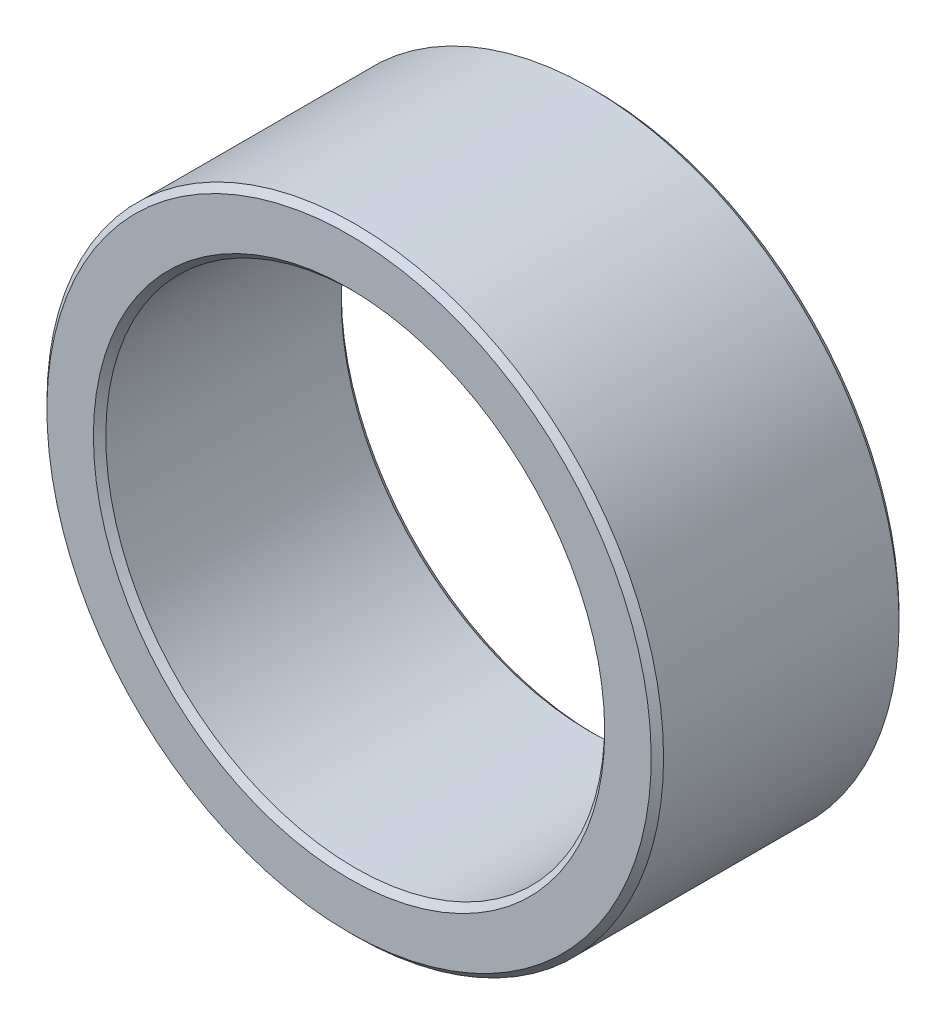
ISO-10303-21;
HEADER;
FILE_DESCRIPTION(('STEP AP214'),'2;1');
FILE_NAME('part.step','',(''),(''),'','','');
FILE_SCHEMA(('AUTOMOTIVE_DESIGN { 1 0 10303 214 1 1 1 1 }'));
ENDSEC;
DATA;
#1=APPLICATION_CONTEXT('core data for automotive mechanical design processes');
#2=APPLICATION_PROTOCOL_DEFINITION('international standard','automotive_design',2000,#1);
#3=PRODUCT_CONTEXT('',#1,'mechanical');
#4=PRODUCT('Part','Part','',(#3));
#5=PRODUCT_RELATED_PRODUCT_CATEGORY('part','',(#4));
#6=PRODUCT_DEFINITION_FORMATION('','',#4);
#7=PRODUCT_DEFINITION_CONTEXT('part definition',#1,'design');
#8=PRODUCT_DEFINITION('design','',#6,#7);
#9=PRODUCT_DEFINITION_SHAPE('','',#8);
#10=(LENGTH_UNIT() NAMED_UNIT(*) SI_UNIT(.MILLI.,.METRE.));
#11=(NAMED_UNIT(*) PLANE_ANGLE_UNIT() SI_UNIT($,.RADIAN.));
#12=(NAMED_UNIT(*) SI_UNIT($,.STERADIAN.) SOLID_ANGLE_UNIT());
#13=UNCERTAINTY_MEASURE_WITH_UNIT(LENGTH_MEASURE(1.E-05),#10,'distance_accuracy_value','');
#14=(GEOMETRIC_REPRESENTATION_CONTEXT(3) GLOBAL_UNCERTAINTY_ASSIGNED_CONTEXT((#13)) GLOBAL_UNIT_ASSIGNED_CONTEXT((#10,
#11,#12)) REPRESENTATION_CONTEXT('',''));
#15=CARTESIAN_POINT('',(0.,0.,0.));
#16=DIRECTION('',(0.,0.,1.));
#17=DIRECTION('',(1.,0.,0.));
#18=AXIS2_PLACEMENT_3D('',#15,#16,#17);
#19=CARTESIAN_POINT('',(0.,0.,1.9));
#20=DIRECTION('',(0.,0.,1.));
#21=DIRECTION('',(0.,-1.,0.));
#22=AXIS2_PLACEMENT_3D('',#19,#20,#21);
#23=CONICAL_SURFACE('',#22,4.025,0.785398163397452);
#24=CARTESIAN_POINT('',(0.,0.,1.9));
#25=DIRECTION('',(0.,0.,1.));
#26=DIRECTION('',(0.,-1.,0.));
#27=AXIS2_PLACEMENT_3D('',#24,#25,#26);
#28=CIRCLE('',#27,4.025);
#29=CARTESIAN_POINT('',(0.,-4.025,1.9));
#30=VERTEX_POINT('',#29);
#31=EDGE_CURVE('E11',#30,#30,#28,.T.);
#32=ORIENTED_EDGE('',*,*,#31,.F.);
#33=EDGE_LOOP('',(#32));
#34=FACE_BOUND('',#33,.T.);
#35=CARTESIAN_POINT('',(0.,0.,2.));
#36=DIRECTION('',(0.,0.,-1.));
#37=DIRECTION('',(0.,-1.,0.));
#38=AXIS2_PLACEMENT_3D('',#35,#36,#37);
#39=CIRCLE('',#38,4.125);
#40=CARTESIAN_POINT('',(0.,-4.125,2.));
#41=VERTEX_POINT('',#40);
#42=EDGE_CURVE('E77',#41,#41,#39,.T.);
#43=ORIENTED_EDGE('',*,*,#42,.F.);
#44=EDGE_LOOP('',(#43));
#45=FACE_BOUND('',#44,.T.);
#46=ADVANCED_FACE('F17',(#34,#45),#23,.F.);
#47=CARTESIAN_POINT('',(0.,0.,-2.));
#48=DIRECTION('',(0.,0.,-1.));
#49=DIRECTION('',(0.,1.,0.));
#50=AXIS2_PLACEMENT_3D('',#47,#48,#49);
#51=CONICAL_SURFACE('',#50,4.125,0.785398163397452);
#52=CARTESIAN_POINT('',(0.,0.,-1.9));
#53=DIRECTION('',(0.,0.,-1.));
#54=DIRECTION('',(0.,-1.,0.));
#55=AXIS2_PLACEMENT_3D('',#52,#53,#54);
#56=CIRCLE('',#55,4.025);
#57=CARTESIAN_POINT('',(0.,-4.025,-1.9));
#58=VERTEX_POINT('',#57);
#59=EDGE_CURVE('E20',#58,#58,#56,.T.);
#60=ORIENTED_EDGE('',*,*,#59,.F.);
#61=EDGE_LOOP('',(#60));
#62=FACE_BOUND('',#61,.T.);
#63=CARTESIAN_POINT('',(0.,0.,-2.));
#64=DIRECTION('',(0.,0.,1.));
#65=DIRECTION('',(0.,-1.,0.));
#66=AXIS2_PLACEMENT_3D('',#63,#64,#65);
#67=CIRCLE('',#66,4.125);
#68=CARTESIAN_POINT('',(0.,-4.125,-2.));
#69=VERTEX_POINT('',#68);
#70=EDGE_CURVE('E67',#69,#69,#67,.T.);
#71=ORIENTED_EDGE('',*,*,#70,.F.);
#72=EDGE_LOOP('',(#71));
#73=FACE_BOUND('',#72,.T.);
#74=ADVANCED_FACE('F157',(#62,#73),#51,.F.);
#75=CARTESIAN_POINT('',(0.,0.,2.));
#76=DIRECTION('',(0.,0.,-1.));
#77=DIRECTION('',(0.,1.,0.));
#78=AXIS2_PLACEMENT_3D('',#75,#76,#77);
#79=CONICAL_SURFACE('',#78,4.875,0.785398163397452);
#80=CARTESIAN_POINT('',(0.,0.,2.));
#81=DIRECTION('',(0.,0.,1.));
#82=DIRECTION('',(0.,-1.,0.));
#83=AXIS2_PLACEMENT_3D('',#80,#81,#82);
#84=CIRCLE('',#83,4.875);
#85=CARTESIAN_POINT('',(0.,-4.875,2.));
#86=VERTEX_POINT('',#85);
#87=EDGE_CURVE('E82',#86,#86,#84,.T.);
#88=ORIENTED_EDGE('',*,*,#87,.F.);
#89=EDGE_LOOP('',(#88));
#90=FACE_BOUND('',#89,.T.);
#91=CARTESIAN_POINT('',(0.,0.,1.9));
#92=DIRECTION('',(0.,0.,-1.));
#93=DIRECTION('',(0.,-1.,0.));
#94=AXIS2_PLACEMENT_3D('',#91,#92,#93);
#95=CIRCLE('',#94,4.975);
#96=CARTESIAN_POINT('',(0.,-4.975,1.9));
#97=VERTEX_POINT('',#96);
#98=EDGE_CURVE('E87',#97,#97,#95,.T.);
#99=ORIENTED_EDGE('',*,*,#98,.F.);
#100=EDGE_LOOP('',(#99));
#101=FACE_BOUND('',#100,.T.);
#102=ADVANCED_FACE('F147',(#90,#101),#79,.T.);
#103=CARTESIAN_POINT('',(0.,0.,-1.9));
#104=DIRECTION('',(0.,0.,1.));
#105=DIRECTION('',(0.,-1.,0.));
#106=AXIS2_PLACEMENT_3D('',#103,#104,#105);
#107=CONICAL_SURFACE('',#106,4.975,0.785398163397444);
#108=CARTESIAN_POINT('',(0.,0.,-2.));
#109=DIRECTION('',(0.,0.,-1.));
#110=DIRECTION('',(0.,-1.,0.));
#111=AXIS2_PLACEMENT_3D('',#108,#109,#110);
#112=CIRCLE('',#111,4.875);
#113=CARTESIAN_POINT('',(0.,-4.875,-2.));
#114=VERTEX_POINT('',#113);
#115=EDGE_CURVE('E71',#114,#114,#112,.T.);
#116=ORIENTED_EDGE('',*,*,#115,.F.);
#117=EDGE_LOOP('',(#116));
#118=FACE_BOUND('',#117,.T.);
#119=CARTESIAN_POINT('',(0.,0.,-1.9));
#120=DIRECTION('',(0.,0.,1.));
#121=DIRECTION('',(0.,-1.,0.));
#122=AXIS2_PLACEMENT_3D('',#119,#120,#121);
#123=CIRCLE('',#122,4.975);
#124=CARTESIAN_POINT('',(0.,-4.975,-1.9));
#125=VERTEX_POINT('',#124);
#126=EDGE_CURVE('E85',#125,#125,#123,.T.);
#127=ORIENTED_EDGE('',*,*,#126,.F.);
#128=EDGE_LOOP('',(#127));
#129=FACE_BOUND('',#128,.T.);
#130=ADVANCED_FACE('F138',(#118,#129),#107,.T.);
#131=CARTESIAN_POINT('',(0.,0.,2.));
#132=DIRECTION('',(0.,0.,-1.));
#133=DIRECTION('',(0.,1.,0.));
#134=AXIS2_PLACEMENT_3D('',#131,#132,#133);
#135=CYLINDRICAL_SURFACE('',#134,4.025);
#136=ORIENTED_EDGE('',*,*,#31,.T.);
#137=EDGE_LOOP('',(#136));
#138=FACE_BOUND('',#137,.T.);
#139=ORIENTED_EDGE('',*,*,#59,.T.);
#140=EDGE_LOOP('',(#139));
#141=FACE_BOUND('',#140,.T.);
#142=ADVANCED_FACE('F129',(#138,#141),#135,.F.);
#143=CARTESIAN_POINT('',(0.,0.,2.));
#144=DIRECTION('',(0.,0.,-1.));
#145=DIRECTION('',(0.,1.,0.));
#146=AXIS2_PLACEMENT_3D('',#143,#144,#145);
#147=CYLINDRICAL_SURFACE('',#146,4.975);
#148=ORIENTED_EDGE('',*,*,#98,.T.);
#149=EDGE_LOOP('',(#148));
#150=FACE_BOUND('',#149,.T.);
#151=ORIENTED_EDGE('',*,*,#126,.T.);
#152=EDGE_LOOP('',(#151));
#153=FACE_BOUND('',#152,.T.);
#154=ADVANCED_FACE('F119',(#150,#153),#147,.T.);
#155=CARTESIAN_POINT('',(0.,0.,2.));
#156=DIRECTION('',(0.,0.,1.));
#157=DIRECTION('',(1.,0.,0.));
#158=AXIS2_PLACEMENT_3D('',#155,#156,#157);
#159=PLANE('',#158);
#160=ORIENTED_EDGE('',*,*,#87,.T.);
#161=EDGE_LOOP('',(#160));
#162=FACE_BOUND('',#161,.T.);
#163=ORIENTED_EDGE('',*,*,#42,.T.);
#164=EDGE_LOOP('',(#163));
#165=FACE_BOUND('',#164,.T.);
#166=ADVANCED_FACE('F108',(#162,#165),#159,.T.);
#167=CARTESIAN_POINT('',(0.,0.,-2.));
#168=DIRECTION('',(0.,0.,1.));
#169=DIRECTION('',(1.,0.,0.));
#170=AXIS2_PLACEMENT_3D('',#167,#168,#169);
#171=PLANE('',#170);
#172=ORIENTED_EDGE('',*,*,#115,.T.);
#173=EDGE_LOOP('',(#172));
#174=FACE_BOUND('',#173,.T.);
#175=ORIENTED_EDGE('',*,*,#70,.T.);
#176=EDGE_LOOP('',(#175));
#177=FACE_BOUND('',#176,.T.);
#178=ADVANCED_FACE('F68',(#174,#177),#171,.F.);
#179=CLOSED_SHELL('',(#46,#74,#102,#130,#142,#154,#166,#178));
#180=MANIFOLD_SOLID_BREP('B1',#179);
#181=ADVANCED_BREP_SHAPE_REPRESENTATION('',(#18,#180),#14);
#182=SHAPE_DEFINITION_REPRESENTATION(#9,#181);
ENDSEC;
END-ISO-10303-21;
